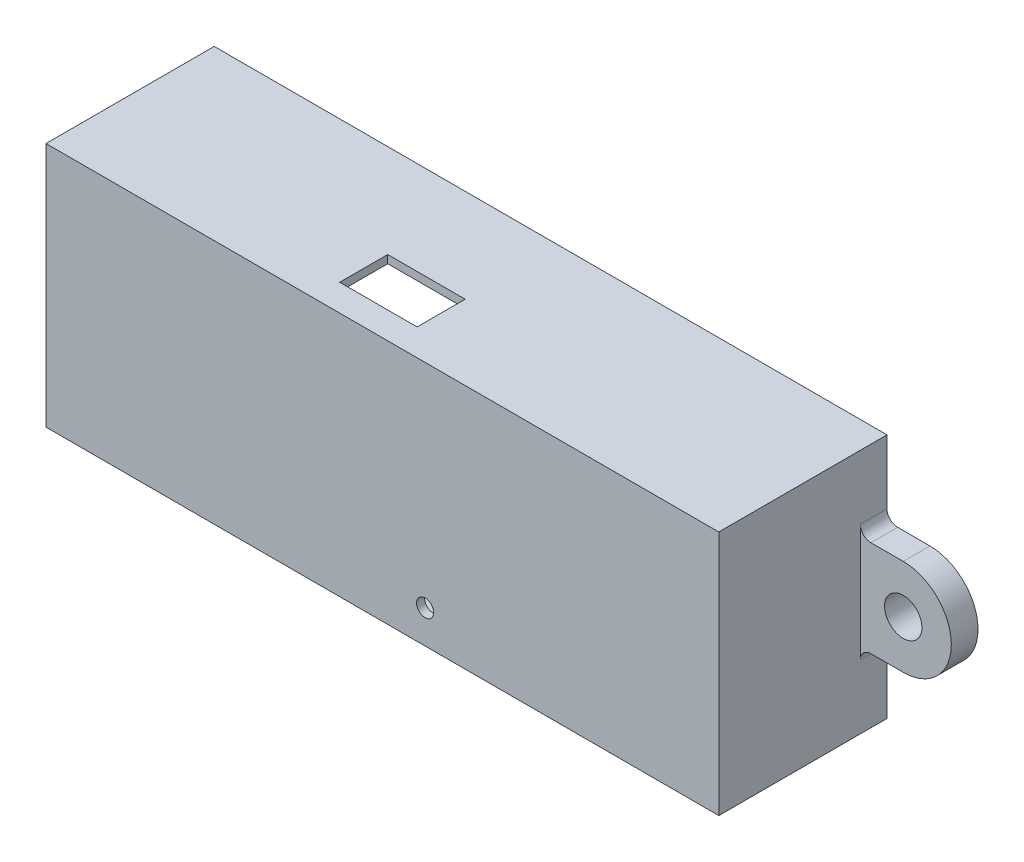
ISO-10303-21;
HEADER;
FILE_DESCRIPTION(('STEP AP214'),'2;1');
FILE_NAME('part.step','',(''),(''),'','','');
FILE_SCHEMA(('AUTOMOTIVE_DESIGN { 1 0 10303 214 1 1 1 1 }'));
ENDSEC;
DATA;
#1=APPLICATION_CONTEXT('core data for automotive mechanical design processes');
#2=APPLICATION_PROTOCOL_DEFINITION('international standard','automotive_design',2000,#1);
#3=PRODUCT_CONTEXT('',#1,'mechanical');
#4=PRODUCT('Part','Part','',(#3));
#5=PRODUCT_RELATED_PRODUCT_CATEGORY('part','',(#4));
#6=PRODUCT_DEFINITION_FORMATION('','',#4);
#7=PRODUCT_DEFINITION_CONTEXT('part definition',#1,'design');
#8=PRODUCT_DEFINITION('design','',#6,#7);
#9=PRODUCT_DEFINITION_SHAPE('','',#8);
#10=(LENGTH_UNIT() NAMED_UNIT(*) SI_UNIT(.MILLI.,.METRE.));
#11=(NAMED_UNIT(*) PLANE_ANGLE_UNIT() SI_UNIT($,.RADIAN.));
#12=(NAMED_UNIT(*) SI_UNIT($,.STERADIAN.) SOLID_ANGLE_UNIT());
#13=UNCERTAINTY_MEASURE_WITH_UNIT(LENGTH_MEASURE(1.E-05),#10,'distance_accuracy_value','');
#14=(GEOMETRIC_REPRESENTATION_CONTEXT(3) GLOBAL_UNCERTAINTY_ASSIGNED_CONTEXT((#13)) GLOBAL_UNIT_ASSIGNED_CONTEXT((#10,
#11,#12)) REPRESENTATION_CONTEXT('',''));
#15=CARTESIAN_POINT('',(0.,0.,0.));
#16=DIRECTION('',(0.,0.,1.));
#17=DIRECTION('',(1.,0.,0.));
#18=AXIS2_PLACEMENT_3D('',#15,#16,#17);
#19=CARTESIAN_POINT('',(0.,0.,1.5));
#20=DIRECTION('',(0.,0.,-1.));
#21=DIRECTION('',(-1.,0.,0.));
#22=AXIS2_PLACEMENT_3D('',#19,#20,#21);
#23=PLANE('',#22);
#24=CARTESIAN_POINT('',(69.5,4.7,1.5));
#25=DIRECTION('',(0.,0.,1.));
#26=DIRECTION('',(1.,0.,0.));
#27=AXIS2_PLACEMENT_3D('',#24,#25,#26);
#28=CIRCLE('',#27,1.60000000000001);
#29=CARTESIAN_POINT('',(71.1,4.7,1.5));
#30=VERTEX_POINT('',#29);
#31=EDGE_CURVE('E271',#30,#30,#28,.T.);
#32=ORIENTED_EDGE('',*,*,#31,.F.);
#33=EDGE_LOOP('',(#32));
#34=FACE_BOUND('',#33,.T.);
#35=DIRECTION('',(0.,-1.,0.));
#36=VECTOR('',#35,1.);
#37=CARTESIAN_POINT('',(124.5,-1.5,1.5));
#38=LINE('',#37,#36);
#39=CARTESIAN_POINT('',(124.5,44.5,1.5));
#40=VERTEX_POINT('',#39);
#41=CARTESIAN_POINT('',(124.5,-1.5,1.5));
#42=VERTEX_POINT('',#41);
#43=EDGE_CURVE('E365',#40,#42,#38,.T.);
#44=ORIENTED_EDGE('',*,*,#43,.F.);
#45=DIRECTION('',(1.,0.,0.));
#46=VECTOR('',#45,1.);
#47=CARTESIAN_POINT('',(124.5,44.5,1.5));
#48=LINE('',#47,#46);
#49=CARTESIAN_POINT('',(-1.5,44.5,1.5));
#50=VERTEX_POINT('',#49);
#51=EDGE_CURVE('E379',#50,#40,#48,.T.);
#52=ORIENTED_EDGE('',*,*,#51,.F.);
#53=DIRECTION('',(0.,1.,0.));
#54=VECTOR('',#53,1.);
#55=CARTESIAN_POINT('',(-1.5,-1.5,1.5));
#56=LINE('',#55,#54);
#57=CARTESIAN_POINT('',(-1.5,-1.5,1.5));
#58=VERTEX_POINT('',#57);
#59=EDGE_CURVE('E376',#58,#50,#56,.T.);
#60=ORIENTED_EDGE('',*,*,#59,.F.);
#61=DIRECTION('',(-1.,0.,0.));
#62=VECTOR('',#61,1.);
#63=CARTESIAN_POINT('',(124.5,-1.5,1.5));
#64=LINE('',#63,#62);
#65=EDGE_CURVE('E373',#42,#58,#64,.T.);
#66=ORIENTED_EDGE('',*,*,#65,.F.);
#67=EDGE_LOOP('',(#44,#52,#60,#66));
#68=FACE_BOUND('',#67,.T.);
#69=ADVANCED_FACE('F38',(#34,#68),#23,.F.);
#70=CARTESIAN_POINT('',(124.5,-1.5,1.5));
#71=DIRECTION('',(1.,0.,0.));
#72=DIRECTION('',(0.,0.,-1.));
#73=AXIS2_PLACEMENT_3D('',#70,#71,#72);
#74=PLANE('',#73);
#75=DIRECTION('',(0.,-1.,0.));
#76=VECTOR('',#75,1.);
#77=CARTESIAN_POINT('',(124.5,-1.5,-30.));
#78=LINE('',#77,#76);
#79=CARTESIAN_POINT('',(124.5,10.5,-30.));
#80=VERTEX_POINT('',#79);
#81=CARTESIAN_POINT('',(124.5,-1.5,-30.));
#82=VERTEX_POINT('',#81);
#83=EDGE_CURVE('E349',#80,#82,#78,.T.);
#84=ORIENTED_EDGE('',*,*,#83,.F.);
#85=DIRECTION('',(0.,0.,-1.));
#86=VECTOR('',#85,1.);
#87=CARTESIAN_POINT('',(124.5,10.5,-25.));
#88=LINE('',#87,#86);
#89=CARTESIAN_POINT('',(124.5,10.5,-25.));
#90=VERTEX_POINT('',#89);
#91=EDGE_CURVE('E433',#80,#90,#88,.F.);
#92=ORIENTED_EDGE('',*,*,#91,.T.);
#93=DIRECTION('',(0.,1.,0.));
#94=VECTOR('',#93,1.);
#95=CARTESIAN_POINT('',(124.5,30.5,-25.));
#96=LINE('',#95,#94);
#97=CARTESIAN_POINT('',(124.5,32.5,-25.));
#98=VERTEX_POINT('',#97);
#99=EDGE_CURVE('E315',#90,#98,#96,.T.);
#100=ORIENTED_EDGE('',*,*,#99,.T.);
#101=DIRECTION('',(0.,0.,-1.));
#102=VECTOR('',#101,1.);
#103=CARTESIAN_POINT('',(124.5,32.5,-30.));
#104=LINE('',#103,#102);
#105=CARTESIAN_POINT('',(124.5,32.5,-30.));
#106=VERTEX_POINT('',#105);
#107=EDGE_CURVE('E430',#98,#106,#104,.T.);
#108=ORIENTED_EDGE('',*,*,#107,.T.);
#109=CARTESIAN_POINT('',(124.5,44.5,-30.));
#110=VERTEX_POINT('',#109);
#111=EDGE_CURVE('E350',#110,#106,#78,.T.);
#112=ORIENTED_EDGE('',*,*,#111,.F.);
#113=DIRECTION('',(0.,0.,-1.));
#114=VECTOR('',#113,1.);
#115=CARTESIAN_POINT('',(124.5,44.5,1.5));
#116=LINE('',#115,#114);
#117=EDGE_CURVE('E383',#40,#110,#116,.T.);
#118=ORIENTED_EDGE('',*,*,#117,.F.);
#119=ORIENTED_EDGE('',*,*,#43,.T.);
#120=DIRECTION('',(0.,0.,-1.));
#121=VECTOR('',#120,1.);
#122=CARTESIAN_POINT('',(124.5,-1.5,1.5));
#123=LINE('',#122,#121);
#124=EDGE_CURVE('E382',#42,#82,#123,.T.);
#125=ORIENTED_EDGE('',*,*,#124,.T.);
#126=EDGE_LOOP('',(#84,#92,#100,#108,#112,#118,#119,#125));
#127=FACE_BOUND('',#126,.T.);
#128=ADVANCED_FACE('F487',(#127),#74,.T.);
#129=CARTESIAN_POINT('',(124.5,44.5,1.5));
#130=DIRECTION('',(0.,1.,0.));
#131=DIRECTION('',(0.,0.,1.));
#132=AXIS2_PLACEMENT_3D('',#129,#130,#131);
#133=PLANE('',#132);
#134=DIRECTION('',(0.,0.,1.));
#135=VECTOR('',#134,1.);
#136=CARTESIAN_POINT('',(48.5,44.5,-3.5));
#137=LINE('',#136,#135);
#138=CARTESIAN_POINT('',(48.5,44.5,-12.5));
#139=VERTEX_POINT('',#138);
#140=CARTESIAN_POINT('',(48.5,44.5,-3.5));
#141=VERTEX_POINT('',#140);
#142=EDGE_CURVE('E244',#139,#141,#137,.T.);
#143=ORIENTED_EDGE('',*,*,#142,.F.);
#144=DIRECTION('',(-1.,0.,0.));
#145=VECTOR('',#144,1.);
#146=CARTESIAN_POINT('',(48.5,44.5,-12.5));
#147=LINE('',#146,#145);
#148=CARTESIAN_POINT('',(63.,44.5,-12.5));
#149=VERTEX_POINT('',#148);
#150=EDGE_CURVE('E249',#149,#139,#147,.T.);
#151=ORIENTED_EDGE('',*,*,#150,.F.);
#152=DIRECTION('',(0.,0.,-1.));
#153=VECTOR('',#152,1.);
#154=CARTESIAN_POINT('',(63.,44.5,-3.5));
#155=LINE('',#154,#153);
#156=CARTESIAN_POINT('',(63.,44.5,-3.5));
#157=VERTEX_POINT('',#156);
#158=EDGE_CURVE('E228',#157,#149,#155,.T.);
#159=ORIENTED_EDGE('',*,*,#158,.F.);
#160=DIRECTION('',(1.,0.,0.));
#161=VECTOR('',#160,1.);
#162=CARTESIAN_POINT('',(48.5,44.5,-3.5));
#163=LINE('',#162,#161);
#164=EDGE_CURVE('E239',#141,#157,#163,.T.);
#165=ORIENTED_EDGE('',*,*,#164,.F.);
#166=EDGE_LOOP('',(#143,#151,#159,#165));
#167=FACE_BOUND('',#166,.T.);
#168=ORIENTED_EDGE('',*,*,#117,.T.);
#169=DIRECTION('',(1.,0.,0.));
#170=VECTOR('',#169,1.);
#171=CARTESIAN_POINT('',(124.5,44.5,-30.));
#172=LINE('',#171,#170);
#173=CARTESIAN_POINT('',(-1.5,44.5,-30.));
#174=VERTEX_POINT('',#173);
#175=EDGE_CURVE('E359',#174,#110,#172,.T.);
#176=ORIENTED_EDGE('',*,*,#175,.F.);
#177=DIRECTION('',(0.,0.,-1.));
#178=VECTOR('',#177,1.);
#179=CARTESIAN_POINT('',(-1.5,44.5,1.5));
#180=LINE('',#179,#178);
#181=EDGE_CURVE('E386',#50,#174,#180,.T.);
#182=ORIENTED_EDGE('',*,*,#181,.F.);
#183=ORIENTED_EDGE('',*,*,#51,.T.);
#184=EDGE_LOOP('',(#168,#176,#182,#183));
#185=FACE_BOUND('',#184,.T.);
#186=ADVANCED_FACE('F246',(#167,#185),#133,.T.);
#187=CARTESIAN_POINT('',(-1.5,-1.5,1.5));
#188=DIRECTION('',(-1.,0.,0.));
#189=DIRECTION('',(0.,0.,1.));
#190=AXIS2_PLACEMENT_3D('',#187,#188,#189);
#191=PLANE('',#190);
#192=DIRECTION('',(0.,1.,0.));
#193=VECTOR('',#192,1.);
#194=CARTESIAN_POINT('',(-1.5,-1.5,-30.));
#195=LINE('',#194,#193);
#196=CARTESIAN_POINT('',(-1.5,32.5,-30.));
#197=VERTEX_POINT('',#196);
#198=EDGE_CURVE('E356',#197,#174,#195,.T.);
#199=ORIENTED_EDGE('',*,*,#198,.F.);
#200=DIRECTION('',(0.,0.,-1.));
#201=VECTOR('',#200,1.);
#202=CARTESIAN_POINT('',(-1.5,32.5,1.5));
#203=LINE('',#202,#201);
#204=CARTESIAN_POINT('',(-1.5,32.5,-25.));
#205=VERTEX_POINT('',#204);
#206=EDGE_CURVE('E444',#197,#205,#203,.F.);
#207=ORIENTED_EDGE('',*,*,#206,.T.);
#208=DIRECTION('',(0.,1.,0.));
#209=VECTOR('',#208,1.);
#210=CARTESIAN_POINT('',(-1.5,30.5,-25.));
#211=LINE('',#210,#209);
#212=CARTESIAN_POINT('',(-1.5,17.3,-25.));
#213=VERTEX_POINT('',#212);
#214=EDGE_CURVE('E289',#213,#205,#211,.T.);
#215=ORIENTED_EDGE('',*,*,#214,.F.);
#216=DIRECTION('',(0.,0.,-1.));
#217=VECTOR('',#216,1.);
#218=CARTESIAN_POINT('',(-1.5,17.3,-22.5));
#219=LINE('',#218,#217);
#220=CARTESIAN_POINT('',(-1.5,17.3,-20.));
#221=VERTEX_POINT('',#220);
#222=EDGE_CURVE('E261',#221,#213,#219,.T.);
#223=ORIENTED_EDGE('',*,*,#222,.F.);
#224=DIRECTION('',(0.,1.,0.));
#225=VECTOR('',#224,1.);
#226=CARTESIAN_POINT('',(-1.5,8.5,-20.));
#227=LINE('',#226,#225);
#228=CARTESIAN_POINT('',(-1.5,8.5,-20.));
#229=VERTEX_POINT('',#228);
#230=EDGE_CURVE('E256',#229,#221,#227,.T.);
#231=ORIENTED_EDGE('',*,*,#230,.F.);
#232=DIRECTION('',(0.,0.,1.));
#233=VECTOR('',#232,1.);
#234=CARTESIAN_POINT('',(-1.5,8.5,-20.));
#235=LINE('',#234,#233);
#236=CARTESIAN_POINT('',(-1.5,8.5,-25.));
#237=VERTEX_POINT('',#236);
#238=EDGE_CURVE('E265',#237,#229,#235,.T.);
#239=ORIENTED_EDGE('',*,*,#238,.F.);
#240=DIRECTION('',(0.,-1.,0.));
#241=VECTOR('',#240,1.);
#242=CARTESIAN_POINT('',(-1.5,9.65,-25.));
#243=LINE('',#242,#241);
#244=CARTESIAN_POINT('',(-1.5,10.5,-25.));
#245=VERTEX_POINT('',#244);
#246=EDGE_CURVE('E263',#245,#237,#243,.T.);
#247=ORIENTED_EDGE('',*,*,#246,.F.);
#248=DIRECTION('',(0.,0.,-1.));
#249=VECTOR('',#248,1.);
#250=CARTESIAN_POINT('',(-1.5,10.5,1.5));
#251=LINE('',#250,#249);
#252=CARTESIAN_POINT('',(-1.5,10.5,-30.));
#253=VERTEX_POINT('',#252);
#254=EDGE_CURVE('E441',#245,#253,#251,.T.);
#255=ORIENTED_EDGE('',*,*,#254,.T.);
#256=CARTESIAN_POINT('',(-1.5,-1.5,-30.));
#257=VERTEX_POINT('',#256);
#258=EDGE_CURVE('E357',#257,#253,#195,.T.);
#259=ORIENTED_EDGE('',*,*,#258,.F.);
#260=DIRECTION('',(0.,0.,-1.));
#261=VECTOR('',#260,1.);
#262=CARTESIAN_POINT('',(-1.5,-1.5,1.5));
#263=LINE('',#262,#261);
#264=EDGE_CURVE('E389',#58,#257,#263,.T.);
#265=ORIENTED_EDGE('',*,*,#264,.F.);
#266=ORIENTED_EDGE('',*,*,#59,.T.);
#267=ORIENTED_EDGE('',*,*,#181,.T.);
#268=EDGE_LOOP('',(#199,#207,#215,#223,#231,#239,#247,#255,#259,#265,#266,#267));
#269=FACE_BOUND('',#268,.T.);
#270=ADVANCED_FACE('F480',(#269),#191,.T.);
#271=CARTESIAN_POINT('',(124.5,-1.5,1.5));
#272=DIRECTION('',(0.,-1.,0.));
#273=DIRECTION('',(0.,0.,-1.));
#274=AXIS2_PLACEMENT_3D('',#271,#272,#273);
#275=PLANE('',#274);
#276=ORIENTED_EDGE('',*,*,#264,.T.);
#277=DIRECTION('',(-1.,0.,0.));
#278=VECTOR('',#277,1.);
#279=CARTESIAN_POINT('',(124.5,-1.5,-30.));
#280=LINE('',#279,#278);
#281=EDGE_CURVE('E353',#82,#257,#280,.T.);
#282=ORIENTED_EDGE('',*,*,#281,.F.);
#283=ORIENTED_EDGE('',*,*,#124,.F.);
#284=ORIENTED_EDGE('',*,*,#65,.T.);
#285=EDGE_LOOP('',(#276,#282,#283,#284));
#286=FACE_BOUND('',#285,.T.);
#287=ADVANCED_FACE('F515',(#286),#275,.T.);
#288=CARTESIAN_POINT('',(123.,0.,1.5));
#289=DIRECTION('',(1.,0.,0.));
#290=DIRECTION('',(0.,0.,-1.));
#291=AXIS2_PLACEMENT_3D('',#288,#289,#290);
#292=PLANE('',#291);
#293=DIRECTION('',(0.,1.,0.));
#294=VECTOR('',#293,1.);
#295=CARTESIAN_POINT('',(123.,0.,0.));
#296=LINE('',#295,#294);
#297=CARTESIAN_POINT('',(123.,0.,0.));
#298=VERTEX_POINT('',#297);
#299=CARTESIAN_POINT('',(123.,43.,0.));
#300=VERTEX_POINT('',#299);
#301=EDGE_CURVE('E398',#298,#300,#296,.T.);
#302=ORIENTED_EDGE('',*,*,#301,.T.);
#303=DIRECTION('',(0.,0.,-1.));
#304=VECTOR('',#303,1.);
#305=CARTESIAN_POINT('',(123.,43.,1.5));
#306=LINE('',#305,#304);
#307=CARTESIAN_POINT('',(123.,43.,-30.));
#308=VERTEX_POINT('',#307);
#309=EDGE_CURVE('E363',#300,#308,#306,.T.);
#310=ORIENTED_EDGE('',*,*,#309,.T.);
#311=DIRECTION('',(0.,-1.,0.));
#312=VECTOR('',#311,1.);
#313=CARTESIAN_POINT('',(123.,0.,-30.));
#314=LINE('',#313,#312);
#315=CARTESIAN_POINT('',(123.,0.,-30.));
#316=VERTEX_POINT('',#315);
#317=EDGE_CURVE('E335',#308,#316,#314,.T.);
#318=ORIENTED_EDGE('',*,*,#317,.T.);
#319=DIRECTION('',(0.,0.,-1.));
#320=VECTOR('',#319,1.);
#321=CARTESIAN_POINT('',(123.,0.,1.5));
#322=LINE('',#321,#320);
#323=EDGE_CURVE('E362',#298,#316,#322,.T.);
#324=ORIENTED_EDGE('',*,*,#323,.F.);
#325=EDGE_LOOP('',(#302,#310,#318,#324));
#326=FACE_BOUND('',#325,.T.);
#327=ADVANCED_FACE('F716',(#326),#292,.F.);
#328=CARTESIAN_POINT('',(123.,43.,1.5));
#329=DIRECTION('',(0.,1.,0.));
#330=DIRECTION('',(0.,0.,1.));
#331=AXIS2_PLACEMENT_3D('',#328,#329,#330);
#332=PLANE('',#331);
#333=DIRECTION('',(-1.,0.,0.));
#334=VECTOR('',#333,1.);
#335=CARTESIAN_POINT('',(123.,43.,-12.5));
#336=LINE('',#335,#334);
#337=CARTESIAN_POINT('',(63.,43.,-12.5));
#338=VERTEX_POINT('',#337);
#339=CARTESIAN_POINT('',(48.5,43.,-12.5));
#340=VERTEX_POINT('',#339);
#341=EDGE_CURVE('E421',#338,#340,#336,.T.);
#342=ORIENTED_EDGE('',*,*,#341,.T.);
#343=DIRECTION('',(0.,0.,1.));
#344=VECTOR('',#343,1.);
#345=CARTESIAN_POINT('',(48.5,43.,1.5));
#346=LINE('',#345,#344);
#347=CARTESIAN_POINT('',(48.5,43.,-3.5));
#348=VERTEX_POINT('',#347);
#349=EDGE_CURVE('E424',#340,#348,#346,.T.);
#350=ORIENTED_EDGE('',*,*,#349,.T.);
#351=DIRECTION('',(1.,0.,0.));
#352=VECTOR('',#351,1.);
#353=CARTESIAN_POINT('',(123.,43.,-3.5));
#354=LINE('',#353,#352);
#355=CARTESIAN_POINT('',(63.,43.,-3.5));
#356=VERTEX_POINT('',#355);
#357=EDGE_CURVE('E418',#348,#356,#354,.T.);
#358=ORIENTED_EDGE('',*,*,#357,.T.);
#359=DIRECTION('',(0.,0.,-1.));
#360=VECTOR('',#359,1.);
#361=CARTESIAN_POINT('',(63.,43.,1.5));
#362=LINE('',#361,#360);
#363=EDGE_CURVE('E231',#356,#338,#362,.T.);
#364=ORIENTED_EDGE('',*,*,#363,.T.);
#365=EDGE_LOOP('',(#342,#350,#358,#364));
#366=FACE_BOUND('',#365,.T.);
#367=DIRECTION('',(-1.,0.,0.));
#368=VECTOR('',#367,1.);
#369=CARTESIAN_POINT('',(0.,43.,0.));
#370=LINE('',#369,#368);
#371=CARTESIAN_POINT('',(0.,43.,0.));
#372=VERTEX_POINT('',#371);
#373=EDGE_CURVE('E401',#300,#372,#370,.T.);
#374=ORIENTED_EDGE('',*,*,#373,.T.);
#375=DIRECTION('',(0.,0.,-1.));
#376=VECTOR('',#375,1.);
#377=CARTESIAN_POINT('',(0.,43.,1.5));
#378=LINE('',#377,#376);
#379=CARTESIAN_POINT('',(0.,43.,-30.));
#380=VERTEX_POINT('',#379);
#381=EDGE_CURVE('E366',#372,#380,#378,.T.);
#382=ORIENTED_EDGE('',*,*,#381,.T.);
#383=DIRECTION('',(1.,0.,0.));
#384=VECTOR('',#383,1.);
#385=CARTESIAN_POINT('',(123.,43.,-30.));
#386=LINE('',#385,#384);
#387=EDGE_CURVE('E346',#380,#308,#386,.T.);
#388=ORIENTED_EDGE('',*,*,#387,.T.);
#389=ORIENTED_EDGE('',*,*,#309,.F.);
#390=EDGE_LOOP('',(#374,#382,#388,#389));
#391=FACE_BOUND('',#390,.T.);
#392=ADVANCED_FACE('F710',(#366,#391),#332,.F.);
#393=CARTESIAN_POINT('',(0.,0.,1.5));
#394=DIRECTION('',(-1.,0.,0.));
#395=DIRECTION('',(0.,0.,1.));
#396=AXIS2_PLACEMENT_3D('',#393,#394,#395);
#397=PLANE('',#396);
#398=DIRECTION('',(0.,0.,1.));
#399=VECTOR('',#398,1.);
#400=CARTESIAN_POINT('',(0.,8.50000000000002,1.49999999999999));
#401=LINE('',#400,#399);
#402=CARTESIAN_POINT('',(0.,8.5,-25.));
#403=VERTEX_POINT('',#402);
#404=CARTESIAN_POINT('',(0.,8.5,-20.));
#405=VERTEX_POINT('',#404);
#406=EDGE_CURVE('E412',#403,#405,#401,.T.);
#407=ORIENTED_EDGE('',*,*,#406,.T.);
#408=DIRECTION('',(0.,1.,0.));
#409=VECTOR('',#408,1.);
#410=CARTESIAN_POINT('',(0.,0.,-20.));
#411=LINE('',#410,#409);
#412=CARTESIAN_POINT('',(0.,17.3,-20.));
#413=VERTEX_POINT('',#412);
#414=EDGE_CURVE('E415',#405,#413,#411,.T.);
#415=ORIENTED_EDGE('',*,*,#414,.T.);
#416=DIRECTION('',(0.,0.,-1.));
#417=VECTOR('',#416,1.);
#418=CARTESIAN_POINT('',(0.,17.3,1.5));
#419=LINE('',#418,#417);
#420=CARTESIAN_POINT('',(0.,17.3,-25.));
#421=VERTEX_POINT('',#420);
#422=EDGE_CURVE('E404',#413,#421,#419,.T.);
#423=ORIENTED_EDGE('',*,*,#422,.T.);
#424=DIRECTION('',(0.,-1.,0.));
#425=VECTOR('',#424,1.);
#426=CARTESIAN_POINT('',(0.,0.,-25.));
#427=LINE('',#426,#425);
#428=EDGE_CURVE('E409',#421,#403,#427,.T.);
#429=ORIENTED_EDGE('',*,*,#428,.T.);
#430=EDGE_LOOP('',(#407,#415,#423,#429));
#431=FACE_BOUND('',#430,.T.);
#432=DIRECTION('',(0.,-1.,0.));
#433=VECTOR('',#432,1.);
#434=CARTESIAN_POINT('',(0.,0.,0.));
#435=LINE('',#434,#433);
#436=CARTESIAN_POINT('',(0.,0.,0.));
#437=VERTEX_POINT('',#436);
#438=EDGE_CURVE('E385',#372,#437,#435,.T.);
#439=ORIENTED_EDGE('',*,*,#438,.T.);
#440=DIRECTION('',(0.,0.,-1.));
#441=VECTOR('',#440,1.);
#442=CARTESIAN_POINT('',(0.,0.,1.5));
#443=LINE('',#442,#441);
#444=CARTESIAN_POINT('',(0.,0.,-30.));
#445=VERTEX_POINT('',#444);
#446=EDGE_CURVE('E368',#437,#445,#443,.T.);
#447=ORIENTED_EDGE('',*,*,#446,.T.);
#448=DIRECTION('',(0.,1.,0.));
#449=VECTOR('',#448,1.);
#450=CARTESIAN_POINT('',(0.,0.,-30.));
#451=LINE('',#450,#449);
#452=EDGE_CURVE('E343',#445,#380,#451,.T.);
#453=ORIENTED_EDGE('',*,*,#452,.T.);
#454=ORIENTED_EDGE('',*,*,#381,.F.);
#455=EDGE_LOOP('',(#439,#447,#453,#454));
#456=FACE_BOUND('',#455,.T.);
#457=ADVANCED_FACE('F715',(#431,#456),#397,.F.);
#458=CARTESIAN_POINT('',(123.,0.,1.5));
#459=DIRECTION('',(0.,-1.,0.));
#460=DIRECTION('',(0.,0.,-1.));
#461=AXIS2_PLACEMENT_3D('',#458,#459,#460);
#462=PLANE('',#461);
#463=DIRECTION('',(1.,0.,0.));
#464=VECTOR('',#463,1.);
#465=CARTESIAN_POINT('',(0.,0.,0.));
#466=LINE('',#465,#464);
#467=EDGE_CURVE('E395',#437,#298,#466,.T.);
#468=ORIENTED_EDGE('',*,*,#467,.T.);
#469=ORIENTED_EDGE('',*,*,#323,.T.);
#470=DIRECTION('',(-1.,0.,0.));
#471=VECTOR('',#470,1.);
#472=CARTESIAN_POINT('',(123.,0.,-30.));
#473=LINE('',#472,#471);
#474=EDGE_CURVE('E340',#316,#445,#473,.T.);
#475=ORIENTED_EDGE('',*,*,#474,.T.);
#476=ORIENTED_EDGE('',*,*,#446,.F.);
#477=EDGE_LOOP('',(#468,#469,#475,#476));
#478=FACE_BOUND('',#477,.T.);
#479=ADVANCED_FACE('F648',(#478),#462,.F.);
#480=CARTESIAN_POINT('',(0.,0.,-30.));
#481=DIRECTION('',(0.,0.,1.));
#482=DIRECTION('',(1.,0.,0.));
#483=AXIS2_PLACEMENT_3D('',#480,#481,#482);
#484=PLANE('',#483);
#485=ORIENTED_EDGE('',*,*,#111,.T.);
#486=CARTESIAN_POINT('',(126.5,32.5,-30.));
#487=DIRECTION('',(0.,0.,1.));
#488=DIRECTION('',(1.,0.,0.));
#489=AXIS2_PLACEMENT_3D('',#486,#487,#488);
#490=CIRCLE('',#489,2.);
#491=CARTESIAN_POINT('',(126.5,30.5,-30.));
#492=VERTEX_POINT('',#491);
#493=EDGE_CURVE('E452',#106,#492,#490,.T.);
#494=ORIENTED_EDGE('',*,*,#493,.T.);
#495=DIRECTION('',(1.,0.,0.));
#496=VECTOR('',#495,1.);
#497=CARTESIAN_POINT('',(124.5,30.5,-30.));
#498=LINE('',#497,#496);
#499=CARTESIAN_POINT('',(132.540026119739,30.5,-30.));
#500=VERTEX_POINT('',#499);
#501=EDGE_CURVE('E312',#492,#500,#498,.T.);
#502=ORIENTED_EDGE('',*,*,#501,.T.);
#503=CARTESIAN_POINT('',(132.540026119739,21.5,-30.));
#504=DIRECTION('',(0.,0.,-1.));
#505=DIRECTION('',(1.,0.,0.));
#506=AXIS2_PLACEMENT_3D('',#503,#504,#505);
#507=CIRCLE('',#506,9.);
#508=CARTESIAN_POINT('',(132.540026119739,12.5,-30.));
#509=VERTEX_POINT('',#508);
#510=EDGE_CURVE('E328',#500,#509,#507,.T.);
#511=ORIENTED_EDGE('',*,*,#510,.T.);
#512=DIRECTION('',(-1.,0.,0.));
#513=VECTOR('',#512,1.);
#514=CARTESIAN_POINT('',(124.5,12.5,-30.));
#515=LINE('',#514,#513);
#516=CARTESIAN_POINT('',(126.5,12.5,-30.));
#517=VERTEX_POINT('',#516);
#518=EDGE_CURVE('E318',#509,#517,#515,.T.);
#519=ORIENTED_EDGE('',*,*,#518,.T.);
#520=CARTESIAN_POINT('',(126.5,10.5,-30.));
#521=DIRECTION('',(0.,0.,1.));
#522=DIRECTION('',(1.,0.,0.));
#523=AXIS2_PLACEMENT_3D('',#520,#521,#522);
#524=CIRCLE('',#523,2.);
#525=EDGE_CURVE('E448',#517,#80,#524,.T.);
#526=ORIENTED_EDGE('',*,*,#525,.T.);
#527=ORIENTED_EDGE('',*,*,#83,.T.);
#528=ORIENTED_EDGE('',*,*,#281,.T.);
#529=ORIENTED_EDGE('',*,*,#258,.T.);
#530=CARTESIAN_POINT('',(-3.5,10.5,-30.));
#531=DIRECTION('',(0.,0.,1.));
#532=DIRECTION('',(1.,0.,0.));
#533=AXIS2_PLACEMENT_3D('',#530,#531,#532);
#534=CIRCLE('',#533,2.);
#535=CARTESIAN_POINT('',(-3.5,12.5,-30.));
#536=VERTEX_POINT('',#535);
#537=EDGE_CURVE('E46',#253,#536,#534,.T.);
#538=ORIENTED_EDGE('',*,*,#537,.T.);
#539=DIRECTION('',(1.,0.,0.));
#540=VECTOR('',#539,1.);
#541=CARTESIAN_POINT('',(-1.5,12.5,-30.));
#542=LINE('',#541,#540);
#543=CARTESIAN_POINT('',(-9.54002611973892,12.5,-30.));
#544=VERTEX_POINT('',#543);
#545=EDGE_CURVE('E285',#544,#536,#542,.T.);
#546=ORIENTED_EDGE('',*,*,#545,.F.);
#547=CARTESIAN_POINT('',(-9.54002611973892,21.5,-30.));
#548=DIRECTION('',(0.,0.,1.));
#549=DIRECTION('',(-1.,0.,0.));
#550=AXIS2_PLACEMENT_3D('',#547,#548,#549);
#551=CIRCLE('',#550,9.);
#552=CARTESIAN_POINT('',(-9.54002611973892,30.5,-30.));
#553=VERTEX_POINT('',#552);
#554=EDGE_CURVE('E300',#553,#544,#551,.T.);
#555=ORIENTED_EDGE('',*,*,#554,.F.);
#556=DIRECTION('',(-1.,0.,0.));
#557=VECTOR('',#556,1.);
#558=CARTESIAN_POINT('',(-1.5,30.5,-30.));
#559=LINE('',#558,#557);
#560=CARTESIAN_POINT('',(-3.5,30.5,-30.));
#561=VERTEX_POINT('',#560);
#562=EDGE_CURVE('E292',#561,#553,#559,.T.);
#563=ORIENTED_EDGE('',*,*,#562,.F.);
#564=CARTESIAN_POINT('',(-3.5,32.5,-30.));
#565=DIRECTION('',(0.,0.,1.));
#566=DIRECTION('',(1.,0.,0.));
#567=AXIS2_PLACEMENT_3D('',#564,#565,#566);
#568=CIRCLE('',#567,2.);
#569=EDGE_CURVE('E457',#561,#197,#568,.T.);
#570=ORIENTED_EDGE('',*,*,#569,.T.);
#571=ORIENTED_EDGE('',*,*,#198,.T.);
#572=ORIENTED_EDGE('',*,*,#175,.T.);
#573=EDGE_LOOP('',(#485,#494,#502,#511,#519,#526,#527,#528,#529,#538,#546,#555,#563,#570,#571,#572));
#574=FACE_BOUND('',#573,.T.);
#575=ORIENTED_EDGE('',*,*,#317,.F.);
#576=ORIENTED_EDGE('',*,*,#387,.F.);
#577=ORIENTED_EDGE('',*,*,#452,.F.);
#578=ORIENTED_EDGE('',*,*,#474,.F.);
#579=EDGE_LOOP('',(#575,#576,#577,#578));
#580=FACE_BOUND('',#579,.T.);
#581=CARTESIAN_POINT('',(132.540026119739,21.5,-30.));
#582=DIRECTION('',(0.,0.,-1.));
#583=DIRECTION('',(-1.,0.,0.));
#584=AXIS2_PLACEMENT_3D('',#581,#582,#583);
#585=CIRCLE('',#584,3.49999999999999);
#586=CARTESIAN_POINT('',(129.040026119739,21.5,-30.));
#587=VERTEX_POINT('',#586);
#588=EDGE_CURVE('E306',#587,#587,#585,.T.);
#589=ORIENTED_EDGE('',*,*,#588,.F.);
#590=EDGE_LOOP('',(#589));
#591=FACE_BOUND('',#590,.T.);
#592=CARTESIAN_POINT('',(-9.54002611973892,21.5,-30.));
#593=DIRECTION('',(0.,0.,1.));
#594=DIRECTION('',(1.,0.,0.));
#595=AXIS2_PLACEMENT_3D('',#592,#593,#594);
#596=CIRCLE('',#595,3.49999999999999);
#597=CARTESIAN_POINT('',(-6.04002611973893,21.5,-30.));
#598=VERTEX_POINT('',#597);
#599=EDGE_CURVE('E286',#598,#598,#596,.T.);
#600=ORIENTED_EDGE('',*,*,#599,.T.);
#601=EDGE_LOOP('',(#600));
#602=FACE_BOUND('',#601,.T.);
#603=ADVANCED_FACE('F476',(#574,#580,#591,#602),#484,.F.);
#604=CARTESIAN_POINT('',(0.,0.,0.));
#605=DIRECTION('',(0.,0.,-1.));
#606=DIRECTION('',(-1.,0.,0.));
#607=AXIS2_PLACEMENT_3D('',#604,#605,#606);
#608=PLANE('',#607);
#609=CARTESIAN_POINT('',(69.5,4.7,0.));
#610=DIRECTION('',(0.,0.,-1.));
#611=DIRECTION('',(-1.,0.,0.));
#612=AXIS2_PLACEMENT_3D('',#609,#610,#611);
#613=CIRCLE('',#612,1.60000000000001);
#614=CARTESIAN_POINT('',(67.9,4.7,0.));
#615=VERTEX_POINT('',#614);
#616=EDGE_CURVE('E281',#615,#615,#613,.T.);
#617=ORIENTED_EDGE('',*,*,#616,.F.);
#618=EDGE_LOOP('',(#617));
#619=FACE_BOUND('',#618,.T.);
#620=ORIENTED_EDGE('',*,*,#438,.F.);
#621=ORIENTED_EDGE('',*,*,#373,.F.);
#622=ORIENTED_EDGE('',*,*,#301,.F.);
#623=ORIENTED_EDGE('',*,*,#467,.F.);
#624=EDGE_LOOP('',(#620,#621,#622,#623));
#625=FACE_BOUND('',#624,.T.);
#626=ADVANCED_FACE('F547',(#619,#625),#608,.T.);
#627=CARTESIAN_POINT('',(124.5,12.5,-25.));
#628=DIRECTION('',(0.,-1.,0.));
#629=DIRECTION('',(1.,0.,0.));
#630=AXIS2_PLACEMENT_3D('',#627,#628,#629);
#631=PLANE('',#630);
#632=DIRECTION('',(-1.,0.,0.));
#633=VECTOR('',#632,1.);
#634=CARTESIAN_POINT('',(124.5,12.5,-25.));
#635=LINE('',#634,#633);
#636=CARTESIAN_POINT('',(132.540026119739,12.5,-25.));
#637=VERTEX_POINT('',#636);
#638=CARTESIAN_POINT('',(126.5,12.5,-25.));
#639=VERTEX_POINT('',#638);
#640=EDGE_CURVE('E323',#637,#639,#635,.T.);
#641=ORIENTED_EDGE('',*,*,#640,.T.);
#642=DIRECTION('',(0.,0.,-1.));
#643=VECTOR('',#642,1.);
#644=CARTESIAN_POINT('',(126.5,12.5,-30.));
#645=LINE('',#644,#643);
#646=EDGE_CURVE('E427',#639,#517,#645,.T.);
#647=ORIENTED_EDGE('',*,*,#646,.T.);
#648=ORIENTED_EDGE('',*,*,#518,.F.);
#649=DIRECTION('',(0.,0.,-1.));
#650=VECTOR('',#649,1.);
#651=CARTESIAN_POINT('',(132.540026119739,12.5,-25.));
#652=LINE('',#651,#650);
#653=EDGE_CURVE('E333',#637,#509,#652,.T.);
#654=ORIENTED_EDGE('',*,*,#653,.F.);
#655=EDGE_LOOP('',(#641,#647,#648,#654));
#656=FACE_BOUND('',#655,.T.);
#657=ADVANCED_FACE('F505',(#656),#631,.T.);
#658=CARTESIAN_POINT('',(132.540026119739,21.5,-25.));
#659=DIRECTION('',(0.,0.,-1.));
#660=DIRECTION('',(-1.,0.,0.));
#661=AXIS2_PLACEMENT_3D('',#658,#659,#660);
#662=CYLINDRICAL_SURFACE('',#661,9.);
#663=ORIENTED_EDGE('',*,*,#510,.F.);
#664=DIRECTION('',(0.,0.,-1.));
#665=VECTOR('',#664,1.);
#666=CARTESIAN_POINT('',(132.540026119739,30.5,-25.));
#667=LINE('',#666,#665);
#668=CARTESIAN_POINT('',(132.540026119739,30.5,-25.));
#669=VERTEX_POINT('',#668);
#670=EDGE_CURVE('E326',#669,#500,#667,.T.);
#671=ORIENTED_EDGE('',*,*,#670,.F.);
#672=CARTESIAN_POINT('',(132.540026119739,21.5,-25.));
#673=DIRECTION('',(0.,0.,-1.));
#674=DIRECTION('',(1.,0.,0.));
#675=AXIS2_PLACEMENT_3D('',#672,#673,#674);
#676=CIRCLE('',#675,9.);
#677=EDGE_CURVE('E320',#669,#637,#676,.T.);
#678=ORIENTED_EDGE('',*,*,#677,.T.);
#679=ORIENTED_EDGE('',*,*,#653,.T.);
#680=EDGE_LOOP('',(#663,#671,#678,#679));
#681=FACE_BOUND('',#680,.T.);
#682=ADVANCED_FACE('F502',(#681),#662,.T.);
#683=CARTESIAN_POINT('',(124.5,30.5,-25.));
#684=DIRECTION('',(0.,1.,0.));
#685=DIRECTION('',(0.,0.,1.));
#686=AXIS2_PLACEMENT_3D('',#683,#684,#685);
#687=PLANE('',#686);
#688=ORIENTED_EDGE('',*,*,#501,.F.);
#689=DIRECTION('',(0.,0.,-1.));
#690=VECTOR('',#689,1.);
#691=CARTESIAN_POINT('',(126.5,30.5,-25.));
#692=LINE('',#691,#690);
#693=CARTESIAN_POINT('',(126.5,30.5,-25.));
#694=VERTEX_POINT('',#693);
#695=EDGE_CURVE('E436',#492,#694,#692,.F.);
#696=ORIENTED_EDGE('',*,*,#695,.T.);
#697=DIRECTION('',(1.,0.,0.));
#698=VECTOR('',#697,1.);
#699=CARTESIAN_POINT('',(124.5,30.5,-25.));
#700=LINE('',#699,#698);
#701=EDGE_CURVE('E317',#694,#669,#700,.T.);
#702=ORIENTED_EDGE('',*,*,#701,.T.);
#703=ORIENTED_EDGE('',*,*,#670,.T.);
#704=EDGE_LOOP('',(#688,#696,#702,#703));
#705=FACE_BOUND('',#704,.T.);
#706=ADVANCED_FACE('F496',(#705),#687,.T.);
#707=CARTESIAN_POINT('',(132.540026119739,21.5,-25.));
#708=DIRECTION('',(0.,0.,1.));
#709=DIRECTION('',(1.,0.,0.));
#710=AXIS2_PLACEMENT_3D('',#707,#708,#709);
#711=PLANE('',#710);
#712=CARTESIAN_POINT('',(132.540026119739,21.5,-25.));
#713=DIRECTION('',(0.,0.,-1.));
#714=DIRECTION('',(-1.,0.,0.));
#715=AXIS2_PLACEMENT_3D('',#712,#713,#714);
#716=CIRCLE('',#715,3.49999999999999);
#717=CARTESIAN_POINT('',(129.040026119739,21.5,-25.));
#718=VERTEX_POINT('',#717);
#719=EDGE_CURVE('E309',#718,#718,#716,.T.);
#720=ORIENTED_EDGE('',*,*,#719,.T.);
#721=EDGE_LOOP('',(#720));
#722=FACE_BOUND('',#721,.T.);
#723=ORIENTED_EDGE('',*,*,#99,.F.);
#724=CARTESIAN_POINT('',(126.5,10.5,-25.));
#725=DIRECTION('',(0.,0.,1.));
#726=DIRECTION('',(1.,0.,0.));
#727=AXIS2_PLACEMENT_3D('',#724,#725,#726);
#728=CIRCLE('',#727,2.);
#729=EDGE_CURVE('E450',#90,#639,#728,.F.);
#730=ORIENTED_EDGE('',*,*,#729,.T.);
#731=ORIENTED_EDGE('',*,*,#640,.F.);
#732=ORIENTED_EDGE('',*,*,#677,.F.);
#733=ORIENTED_EDGE('',*,*,#701,.F.);
#734=CARTESIAN_POINT('',(126.5,32.5,-25.));
#735=DIRECTION('',(0.,0.,1.));
#736=DIRECTION('',(1.,0.,0.));
#737=AXIS2_PLACEMENT_3D('',#734,#735,#736);
#738=CIRCLE('',#737,2.);
#739=EDGE_CURVE('E454',#694,#98,#738,.F.);
#740=ORIENTED_EDGE('',*,*,#739,.T.);
#741=EDGE_LOOP('',(#723,#730,#731,#732,#733,#740));
#742=FACE_BOUND('',#741,.T.);
#743=ADVANCED_FACE('F613',(#722,#742),#711,.T.);
#744=CARTESIAN_POINT('',(132.540026119739,21.5,-25.));
#745=DIRECTION('',(0.,0.,-1.));
#746=DIRECTION('',(-1.,0.,0.));
#747=AXIS2_PLACEMENT_3D('',#744,#745,#746);
#748=CYLINDRICAL_SURFACE('',#747,3.49999999999999);
#749=ORIENTED_EDGE('',*,*,#719,.F.);
#750=EDGE_LOOP('',(#749));
#751=FACE_BOUND('',#750,.T.);
#752=ORIENTED_EDGE('',*,*,#588,.T.);
#753=EDGE_LOOP('',(#752));
#754=FACE_BOUND('',#753,.T.);
#755=ADVANCED_FACE('F605',(#751,#754),#748,.F.);
#756=CARTESIAN_POINT('',(-9.54002611973892,21.5,-25.));
#757=DIRECTION('',(0.,0.,1.));
#758=DIRECTION('',(-1.,0.,0.));
#759=AXIS2_PLACEMENT_3D('',#756,#757,#758);
#760=PLANE('',#759);
#761=DIRECTION('',(1.,0.,0.));
#762=VECTOR('',#761,1.);
#763=CARTESIAN_POINT('',(-1.5,12.5,-25.));
#764=LINE('',#763,#762);
#765=CARTESIAN_POINT('',(-9.54002611973892,12.5,-25.));
#766=VERTEX_POINT('',#765);
#767=CARTESIAN_POINT('',(-3.5,12.5,-25.));
#768=VERTEX_POINT('',#767);
#769=EDGE_CURVE('E291',#766,#768,#764,.T.);
#770=ORIENTED_EDGE('',*,*,#769,.T.);
#771=CARTESIAN_POINT('',(-3.5,10.5,-25.));
#772=DIRECTION('',(0.,0.,1.));
#773=DIRECTION('',(1.,0.,0.));
#774=AXIS2_PLACEMENT_3D('',#771,#772,#773);
#775=CIRCLE('',#774,2.);
#776=EDGE_CURVE('E11',#768,#245,#775,.F.);
#777=ORIENTED_EDGE('',*,*,#776,.T.);
#778=ORIENTED_EDGE('',*,*,#246,.T.);
#779=DIRECTION('',(-1.,0.,0.));
#780=VECTOR('',#779,1.);
#781=CARTESIAN_POINT('',(8.5,8.5,-25.));
#782=LINE('',#781,#780);
#783=EDGE_CURVE('E272',#403,#237,#782,.T.);
#784=ORIENTED_EDGE('',*,*,#783,.F.);
#785=ORIENTED_EDGE('',*,*,#428,.F.);
#786=DIRECTION('',(-1.,0.,0.));
#787=VECTOR('',#786,1.);
#788=CARTESIAN_POINT('',(8.5,17.3,-25.));
#789=LINE('',#788,#787);
#790=EDGE_CURVE('E275',#421,#213,#789,.T.);
#791=ORIENTED_EDGE('',*,*,#790,.T.);
#792=ORIENTED_EDGE('',*,*,#214,.T.);
#793=CARTESIAN_POINT('',(-3.5,32.5,-25.));
#794=DIRECTION('',(0.,0.,1.));
#795=DIRECTION('',(1.,0.,0.));
#796=AXIS2_PLACEMENT_3D('',#793,#794,#795);
#797=CIRCLE('',#796,2.);
#798=CARTESIAN_POINT('',(-3.5,30.5,-25.));
#799=VERTEX_POINT('',#798);
#800=EDGE_CURVE('E459',#205,#799,#797,.F.);
#801=ORIENTED_EDGE('',*,*,#800,.T.);
#802=DIRECTION('',(-1.,0.,0.));
#803=VECTOR('',#802,1.);
#804=CARTESIAN_POINT('',(-1.5,30.5,-25.));
#805=LINE('',#804,#803);
#806=CARTESIAN_POINT('',(-9.54002611973892,30.5,-25.));
#807=VERTEX_POINT('',#806);
#808=EDGE_CURVE('E296',#799,#807,#805,.T.);
#809=ORIENTED_EDGE('',*,*,#808,.T.);
#810=CARTESIAN_POINT('',(-9.54002611973892,21.5,-25.));
#811=DIRECTION('',(0.,0.,1.));
#812=DIRECTION('',(-1.,0.,0.));
#813=AXIS2_PLACEMENT_3D('',#810,#811,#812);
#814=CIRCLE('',#813,9.);
#815=EDGE_CURVE('E294',#807,#766,#814,.T.);
#816=ORIENTED_EDGE('',*,*,#815,.T.);
#817=EDGE_LOOP('',(#770,#777,#778,#784,#785,#791,#792,#801,#809,#816));
#818=FACE_BOUND('',#817,.T.);
#819=CARTESIAN_POINT('',(-9.54002611973892,21.5,-25.));
#820=DIRECTION('',(0.,0.,1.));
#821=DIRECTION('',(1.,0.,0.));
#822=AXIS2_PLACEMENT_3D('',#819,#820,#821);
#823=CIRCLE('',#822,3.49999999999999);
#824=CARTESIAN_POINT('',(-6.04002611973893,21.5,-25.));
#825=VERTEX_POINT('',#824);
#826=EDGE_CURVE('E282',#825,#825,#823,.T.);
#827=ORIENTED_EDGE('',*,*,#826,.F.);
#828=EDGE_LOOP('',(#827));
#829=FACE_BOUND('',#828,.T.);
#830=ADVANCED_FACE('F463',(#818,#829),#760,.T.);
#831=CARTESIAN_POINT('',(-1.5,30.5,-25.));
#832=DIRECTION('',(0.,-1.,0.));
#833=DIRECTION('',(0.,0.,-1.));
#834=AXIS2_PLACEMENT_3D('',#831,#832,#833);
#835=PLANE('',#834);
#836=ORIENTED_EDGE('',*,*,#808,.F.);
#837=DIRECTION('',(0.,0.,-1.));
#838=VECTOR('',#837,1.);
#839=CARTESIAN_POINT('',(-3.5,30.5,-25.));
#840=LINE('',#839,#838);
#841=EDGE_CURVE('E438',#799,#561,#840,.T.);
#842=ORIENTED_EDGE('',*,*,#841,.T.);
#843=ORIENTED_EDGE('',*,*,#562,.T.);
#844=DIRECTION('',(0.,0.,-1.));
#845=VECTOR('',#844,1.);
#846=CARTESIAN_POINT('',(-9.54002611973892,30.5,-25.));
#847=LINE('',#846,#845);
#848=EDGE_CURVE('E303',#807,#553,#847,.T.);
#849=ORIENTED_EDGE('',*,*,#848,.F.);
#850=EDGE_LOOP('',(#836,#842,#843,#849));
#851=FACE_BOUND('',#850,.T.);
#852=ADVANCED_FACE('F471',(#851),#835,.F.);
#853=CARTESIAN_POINT('',(-9.54002611973892,21.5,-25.));
#854=DIRECTION('',(0.,0.,-1.));
#855=DIRECTION('',(-1.,0.,0.));
#856=AXIS2_PLACEMENT_3D('',#853,#854,#855);
#857=CYLINDRICAL_SURFACE('',#856,9.);
#858=ORIENTED_EDGE('',*,*,#554,.T.);
#859=DIRECTION('',(0.,0.,-1.));
#860=VECTOR('',#859,1.);
#861=CARTESIAN_POINT('',(-9.54002611973892,12.5,-25.));
#862=LINE('',#861,#860);
#863=EDGE_CURVE('E298',#766,#544,#862,.T.);
#864=ORIENTED_EDGE('',*,*,#863,.F.);
#865=ORIENTED_EDGE('',*,*,#815,.F.);
#866=ORIENTED_EDGE('',*,*,#848,.T.);
#867=EDGE_LOOP('',(#858,#864,#865,#866));
#868=FACE_BOUND('',#867,.T.);
#869=ADVANCED_FACE('F526',(#868),#857,.T.);
#870=CARTESIAN_POINT('',(-1.5,12.5,-25.));
#871=DIRECTION('',(0.,1.,0.));
#872=DIRECTION('',(-1.,0.,0.));
#873=AXIS2_PLACEMENT_3D('',#870,#871,#872);
#874=PLANE('',#873);
#875=ORIENTED_EDGE('',*,*,#545,.T.);
#876=DIRECTION('',(0.,0.,-1.));
#877=VECTOR('',#876,1.);
#878=CARTESIAN_POINT('',(-3.5,12.5,-25.));
#879=LINE('',#878,#877);
#880=EDGE_CURVE('E53',#536,#768,#879,.F.);
#881=ORIENTED_EDGE('',*,*,#880,.T.);
#882=ORIENTED_EDGE('',*,*,#769,.F.);
#883=ORIENTED_EDGE('',*,*,#863,.T.);
#884=EDGE_LOOP('',(#875,#881,#882,#883));
#885=FACE_BOUND('',#884,.T.);
#886=ADVANCED_FACE('F524',(#885),#874,.F.);
#887=CARTESIAN_POINT('',(-9.54002611973892,21.5,-25.));
#888=DIRECTION('',(0.,0.,-1.));
#889=DIRECTION('',(-1.,0.,0.));
#890=AXIS2_PLACEMENT_3D('',#887,#888,#889);
#891=CYLINDRICAL_SURFACE('',#890,3.49999999999999);
#892=ORIENTED_EDGE('',*,*,#826,.T.);
#893=EDGE_LOOP('',(#892));
#894=FACE_BOUND('',#893,.T.);
#895=ORIENTED_EDGE('',*,*,#599,.F.);
#896=EDGE_LOOP('',(#895));
#897=FACE_BOUND('',#896,.T.);
#898=ADVANCED_FACE('F533',(#894,#897),#891,.F.);
#899=CARTESIAN_POINT('',(69.5,4.7,-8.5));
#900=DIRECTION('',(0.,0.,1.));
#901=DIRECTION('',(1.,0.,0.));
#902=AXIS2_PLACEMENT_3D('',#899,#900,#901);
#903=CYLINDRICAL_SURFACE('',#902,1.60000000000001);
#904=ORIENTED_EDGE('',*,*,#616,.T.);
#905=EDGE_LOOP('',(#904));
#906=FACE_BOUND('',#905,.T.);
#907=ORIENTED_EDGE('',*,*,#31,.T.);
#908=EDGE_LOOP('',(#907));
#909=FACE_BOUND('',#908,.T.);
#910=ADVANCED_FACE('F755',(#906,#909),#903,.F.);
#911=CARTESIAN_POINT('',(8.5,8.5,-20.));
#912=DIRECTION('',(0.,0.,1.));
#913=DIRECTION('',(0.,-1.,0.));
#914=AXIS2_PLACEMENT_3D('',#911,#912,#913);
#915=PLANE('',#914);
#916=DIRECTION('',(-1.,0.,0.));
#917=VECTOR('',#916,1.);
#918=CARTESIAN_POINT('',(8.5,8.5,-20.));
#919=LINE('',#918,#917);
#920=EDGE_CURVE('E269',#405,#229,#919,.T.);
#921=ORIENTED_EDGE('',*,*,#920,.T.);
#922=ORIENTED_EDGE('',*,*,#230,.T.);
#923=DIRECTION('',(-1.,0.,0.));
#924=VECTOR('',#923,1.);
#925=CARTESIAN_POINT('',(8.5,17.3,-20.));
#926=LINE('',#925,#924);
#927=EDGE_CURVE('E268',#413,#221,#926,.T.);
#928=ORIENTED_EDGE('',*,*,#927,.F.);
#929=ORIENTED_EDGE('',*,*,#414,.F.);
#930=EDGE_LOOP('',(#921,#922,#928,#929));
#931=FACE_BOUND('',#930,.T.);
#932=ADVANCED_FACE('F745',(#931),#915,.F.);
#933=CARTESIAN_POINT('',(8.5,8.5,-20.));
#934=DIRECTION('',(0.,-1.,0.));
#935=DIRECTION('',(0.,0.,-1.));
#936=AXIS2_PLACEMENT_3D('',#933,#934,#935);
#937=PLANE('',#936);
#938=ORIENTED_EDGE('',*,*,#783,.T.);
#939=ORIENTED_EDGE('',*,*,#238,.T.);
#940=ORIENTED_EDGE('',*,*,#920,.F.);
#941=ORIENTED_EDGE('',*,*,#406,.F.);
#942=EDGE_LOOP('',(#938,#939,#940,#941));
#943=FACE_BOUND('',#942,.T.);
#944=ADVANCED_FACE('F734',(#943),#937,.F.);
#945=CARTESIAN_POINT('',(8.5,17.3,-22.5));
#946=DIRECTION('',(0.,1.,0.));
#947=DIRECTION('',(0.,0.,1.));
#948=AXIS2_PLACEMENT_3D('',#945,#946,#947);
#949=PLANE('',#948);
#950=ORIENTED_EDGE('',*,*,#927,.T.);
#951=ORIENTED_EDGE('',*,*,#222,.T.);
#952=ORIENTED_EDGE('',*,*,#790,.F.);
#953=ORIENTED_EDGE('',*,*,#422,.F.);
#954=EDGE_LOOP('',(#950,#951,#952,#953));
#955=FACE_BOUND('',#954,.T.);
#956=ADVANCED_FACE('F702',(#955),#949,.F.);
#957=CARTESIAN_POINT('',(48.5,34.5,-3.5));
#958=DIRECTION('',(-1.,0.,0.));
#959=DIRECTION('',(0.,0.,1.));
#960=AXIS2_PLACEMENT_3D('',#957,#958,#959);
#961=PLANE('',#960);
#962=DIRECTION('',(0.,1.,0.));
#963=VECTOR('',#962,1.);
#964=CARTESIAN_POINT('',(48.5,34.5,-12.5));
#965=LINE('',#964,#963);
#966=EDGE_CURVE('E254',#340,#139,#965,.T.);
#967=ORIENTED_EDGE('',*,*,#966,.T.);
#968=ORIENTED_EDGE('',*,*,#142,.T.);
#969=DIRECTION('',(0.,1.,0.));
#970=VECTOR('',#969,1.);
#971=CARTESIAN_POINT('',(48.5,34.5,-3.5));
#972=LINE('',#971,#970);
#973=EDGE_CURVE('E235',#348,#141,#972,.T.);
#974=ORIENTED_EDGE('',*,*,#973,.F.);
#975=ORIENTED_EDGE('',*,*,#349,.F.);
#976=EDGE_LOOP('',(#967,#968,#974,#975));
#977=FACE_BOUND('',#976,.T.);
#978=ADVANCED_FACE('F692',(#977),#961,.F.);
#979=CARTESIAN_POINT('',(48.5,34.5,-12.5));
#980=DIRECTION('',(0.,0.,-1.));
#981=DIRECTION('',(-1.,0.,0.));
#982=AXIS2_PLACEMENT_3D('',#979,#980,#981);
#983=PLANE('',#982);
#984=DIRECTION('',(0.,1.,0.));
#985=VECTOR('',#984,1.);
#986=CARTESIAN_POINT('',(63.,34.5,-12.5));
#987=LINE('',#986,#985);
#988=EDGE_CURVE('E234',#338,#149,#987,.T.);
#989=ORIENTED_EDGE('',*,*,#988,.T.);
#990=ORIENTED_EDGE('',*,*,#150,.T.);
#991=ORIENTED_EDGE('',*,*,#966,.F.);
#992=ORIENTED_EDGE('',*,*,#341,.F.);
#993=EDGE_LOOP('',(#989,#990,#991,#992));
#994=FACE_BOUND('',#993,.T.);
#995=ADVANCED_FACE('F683',(#994),#983,.F.);
#996=CARTESIAN_POINT('',(63.,34.5,-3.5));
#997=DIRECTION('',(1.,0.,0.));
#998=DIRECTION('',(0.,0.,-1.));
#999=AXIS2_PLACEMENT_3D('',#996,#997,#998);
#1000=PLANE('',#999);
#1001=DIRECTION('',(0.,1.,0.));
#1002=VECTOR('',#1001,1.);
#1003=CARTESIAN_POINT('',(63.,34.5,-3.5));
#1004=LINE('',#1003,#1002);
#1005=EDGE_CURVE('E223',#356,#157,#1004,.T.);
#1006=ORIENTED_EDGE('',*,*,#1005,.T.);
#1007=ORIENTED_EDGE('',*,*,#158,.T.);
#1008=ORIENTED_EDGE('',*,*,#988,.F.);
#1009=ORIENTED_EDGE('',*,*,#363,.F.);
#1010=EDGE_LOOP('',(#1006,#1007,#1008,#1009));
#1011=FACE_BOUND('',#1010,.T.);
#1012=ADVANCED_FACE('F225',(#1011),#1000,.F.);
#1013=CARTESIAN_POINT('',(48.5,34.5,-3.5));
#1014=DIRECTION('',(0.,0.,1.));
#1015=DIRECTION('',(1.,0.,0.));
#1016=AXIS2_PLACEMENT_3D('',#1013,#1014,#1015);
#1017=PLANE('',#1016);
#1018=ORIENTED_EDGE('',*,*,#973,.T.);
#1019=ORIENTED_EDGE('',*,*,#164,.T.);
#1020=ORIENTED_EDGE('',*,*,#1005,.F.);
#1021=ORIENTED_EDGE('',*,*,#357,.F.);
#1022=EDGE_LOOP('',(#1018,#1019,#1020,#1021));
#1023=FACE_BOUND('',#1022,.T.);
#1024=ADVANCED_FACE('F240',(#1023),#1017,.F.);
#1025=CARTESIAN_POINT('',(126.5,10.5,-25.));
#1026=DIRECTION('',(0.,0.,1.));
#1027=DIRECTION('',(1.,0.,0.));
#1028=AXIS2_PLACEMENT_3D('',#1025,#1026,#1027);
#1029=CYLINDRICAL_SURFACE('',#1028,2.);
#1030=ORIENTED_EDGE('',*,*,#729,.F.);
#1031=ORIENTED_EDGE('',*,*,#91,.F.);
#1032=ORIENTED_EDGE('',*,*,#525,.F.);
#1033=ORIENTED_EDGE('',*,*,#646,.F.);
#1034=EDGE_LOOP('',(#1030,#1031,#1032,#1033));
#1035=FACE_BOUND('',#1034,.T.);
#1036=ADVANCED_FACE('F510',(#1035),#1029,.F.);
#1037=CARTESIAN_POINT('',(126.5,32.5,1.5));
#1038=DIRECTION('',(0.,0.,1.));
#1039=DIRECTION('',(1.,0.,0.));
#1040=AXIS2_PLACEMENT_3D('',#1037,#1038,#1039);
#1041=CYLINDRICAL_SURFACE('',#1040,2.);
#1042=ORIENTED_EDGE('',*,*,#739,.F.);
#1043=ORIENTED_EDGE('',*,*,#695,.F.);
#1044=ORIENTED_EDGE('',*,*,#493,.F.);
#1045=ORIENTED_EDGE('',*,*,#107,.F.);
#1046=EDGE_LOOP('',(#1042,#1043,#1044,#1045));
#1047=FACE_BOUND('',#1046,.T.);
#1048=ADVANCED_FACE('F492',(#1047),#1041,.F.);
#1049=CARTESIAN_POINT('',(-3.5,32.5,-25.));
#1050=DIRECTION('',(0.,0.,-1.));
#1051=DIRECTION('',(-1.,0.,0.));
#1052=AXIS2_PLACEMENT_3D('',#1049,#1050,#1051);
#1053=CYLINDRICAL_SURFACE('',#1052,2.);
#1054=ORIENTED_EDGE('',*,*,#800,.F.);
#1055=ORIENTED_EDGE('',*,*,#206,.F.);
#1056=ORIENTED_EDGE('',*,*,#569,.F.);
#1057=ORIENTED_EDGE('',*,*,#841,.F.);
#1058=EDGE_LOOP('',(#1054,#1055,#1056,#1057));
#1059=FACE_BOUND('',#1058,.T.);
#1060=ADVANCED_FACE('F474',(#1059),#1053,.F.);
#1061=CARTESIAN_POINT('',(-3.5,10.5,1.5));
#1062=DIRECTION('',(0.,0.,-1.));
#1063=DIRECTION('',(-1.,0.,0.));
#1064=AXIS2_PLACEMENT_3D('',#1061,#1062,#1063);
#1065=CYLINDRICAL_SURFACE('',#1064,2.);
#1066=ORIENTED_EDGE('',*,*,#776,.F.);
#1067=ORIENTED_EDGE('',*,*,#880,.F.);
#1068=ORIENTED_EDGE('',*,*,#537,.F.);
#1069=ORIENTED_EDGE('',*,*,#254,.F.);
#1070=EDGE_LOOP('',(#1066,#1067,#1068,#1069));
#1071=FACE_BOUND('',#1070,.T.);
#1072=ADVANCED_FACE('F40',(#1071),#1065,.F.);
#1073=CLOSED_SHELL('',(#69,#128,#186,#270,#287,#327,#392,#457,#479,#603,#626,#657,#682,#706,
#743,#755,#830,#852,#869,#886,#898,#910,#932,#944,#956,#978,#995,#1012,#1024,#1036,#1048,#1060,#1072));
#1074=MANIFOLD_SOLID_BREP('B2',#1073);
#1075=ADVANCED_BREP_SHAPE_REPRESENTATION('',(#18,#1074),#14);
#1076=SHAPE_DEFINITION_REPRESENTATION(#9,#1075);
ENDSEC;
END-ISO-10303-21;
